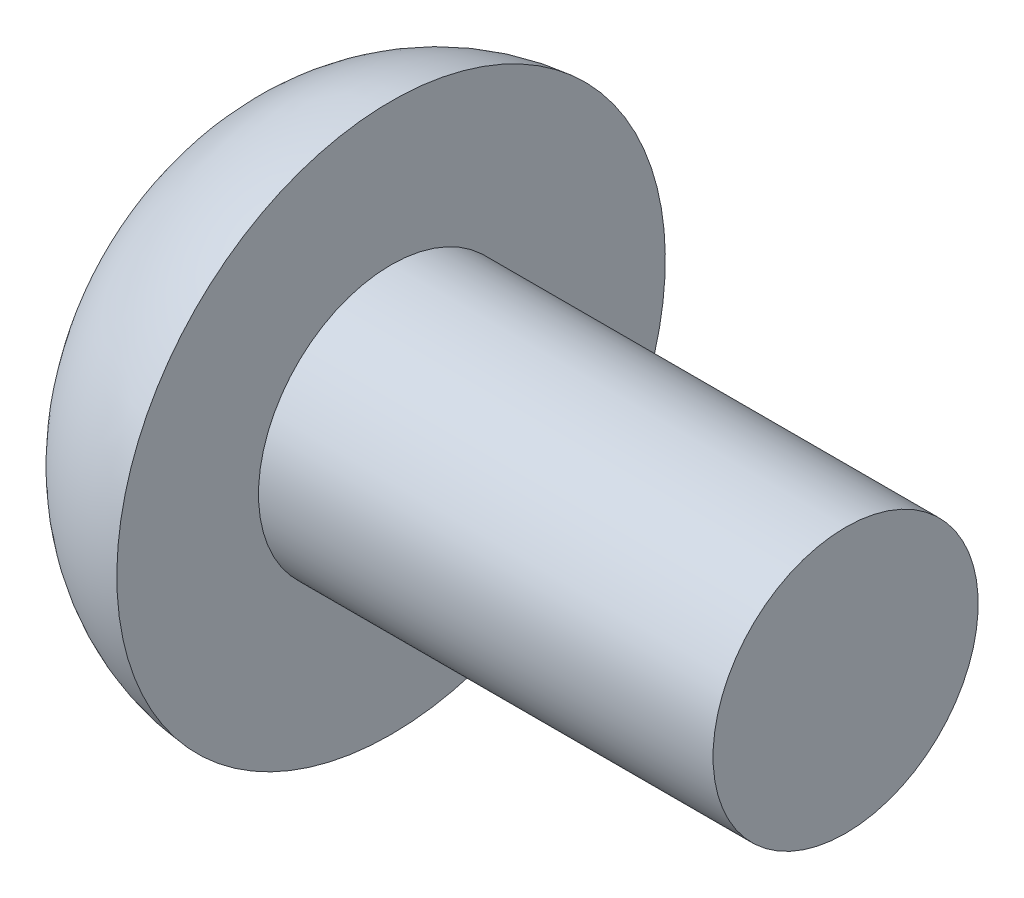
ISO-10303-21;
HEADER;
FILE_DESCRIPTION(('STEP AP214'),'2;1');
FILE_NAME('part.step','',(''),(''),'','','');
FILE_SCHEMA(('AUTOMOTIVE_DESIGN { 1 0 10303 214 1 1 1 1 }'));
ENDSEC;
DATA;
#1=APPLICATION_CONTEXT('core data for automotive mechanical design processes');
#2=APPLICATION_PROTOCOL_DEFINITION('international standard','automotive_design',2000,#1);
#3=PRODUCT_CONTEXT('',#1,'mechanical');
#4=PRODUCT('Part','Part','',(#3));
#5=PRODUCT_RELATED_PRODUCT_CATEGORY('part','',(#4));
#6=PRODUCT_DEFINITION_FORMATION('','',#4);
#7=PRODUCT_DEFINITION_CONTEXT('part definition',#1,'design');
#8=PRODUCT_DEFINITION('design','',#6,#7);
#9=PRODUCT_DEFINITION_SHAPE('','',#8);
#10=(LENGTH_UNIT() NAMED_UNIT(*) SI_UNIT(.MILLI.,.METRE.));
#11=(NAMED_UNIT(*) PLANE_ANGLE_UNIT() SI_UNIT($,.RADIAN.));
#12=(NAMED_UNIT(*) SI_UNIT($,.STERADIAN.) SOLID_ANGLE_UNIT());
#13=UNCERTAINTY_MEASURE_WITH_UNIT(LENGTH_MEASURE(1.E-05),#10,'distance_accuracy_value','');
#14=(GEOMETRIC_REPRESENTATION_CONTEXT(3) GLOBAL_UNCERTAINTY_ASSIGNED_CONTEXT((#13)) GLOBAL_UNIT_ASSIGNED_CONTEXT((#10,
#11,#12)) REPRESENTATION_CONTEXT('',''));
#15=CARTESIAN_POINT('',(0.,0.,0.));
#16=DIRECTION('',(0.,0.,1.));
#17=DIRECTION('',(1.,0.,0.));
#18=AXIS2_PLACEMENT_3D('',#15,#16,#17);
#19=CARTESIAN_POINT('',(8.2,1.75,0.));
#20=DIRECTION('',(-1.,0.,0.));
#21=DIRECTION('',(0.,-1.,0.));
#22=AXIS2_PLACEMENT_3D('',#19,#20,#21);
#23=PLANE('',#22);
#24=CARTESIAN_POINT('',(8.2,0.,0.));
#25=DIRECTION('',(-1.,0.,0.));
#26=DIRECTION('',(0.,-1.,0.));
#27=AXIS2_PLACEMENT_3D('',#24,#25,#26);
#28=CIRCLE('',#27,1.75);
#29=CARTESIAN_POINT('',(8.2,-1.75,0.));
#30=VERTEX_POINT('',#29);
#31=EDGE_CURVE('E11',#30,#30,#28,.T.);
#32=ORIENTED_EDGE('',*,*,#31,.F.);
#33=EDGE_LOOP('',(#32));
#34=FACE_BOUND('',#33,.T.);
#35=ADVANCED_FACE('F39',(#34),#23,.F.);
#36=CARTESIAN_POINT('',(0.,0.,0.));
#37=DIRECTION('',(-1.,0.,0.));
#38=DIRECTION('',(0.,-1.,0.));
#39=AXIS2_PLACEMENT_3D('',#36,#37,#38);
#40=CYLINDRICAL_SURFACE('',#39,1.75);
#41=CARTESIAN_POINT('',(2.2,0.,0.));
#42=DIRECTION('',(-1.,0.,0.));
#43=DIRECTION('',(0.,-1.,0.));
#44=AXIS2_PLACEMENT_3D('',#41,#42,#43);
#45=CIRCLE('',#44,1.75);
#46=CARTESIAN_POINT('',(2.2,-1.75,0.));
#47=VERTEX_POINT('',#46);
#48=EDGE_CURVE('E46',#47,#47,#45,.T.);
#49=ORIENTED_EDGE('',*,*,#48,.F.);
#50=EDGE_LOOP('',(#49));
#51=FACE_BOUND('',#50,.T.);
#52=ORIENTED_EDGE('',*,*,#31,.T.);
#53=EDGE_LOOP('',(#52));
#54=FACE_BOUND('',#53,.T.);
#55=ADVANCED_FACE('F155',(#51,#54),#40,.T.);
#56=CARTESIAN_POINT('',(2.2,3.62,0.));
#57=DIRECTION('',(-1.,0.,0.));
#58=DIRECTION('',(0.,-1.,0.));
#59=AXIS2_PLACEMENT_3D('',#56,#57,#58);
#60=PLANE('',#59);
#61=CARTESIAN_POINT('',(2.2,0.,0.));
#62=DIRECTION('',(-1.,0.,0.));
#63=DIRECTION('',(0.,-1.,0.));
#64=AXIS2_PLACEMENT_3D('',#61,#62,#63);
#65=CIRCLE('',#64,3.62);
#66=CARTESIAN_POINT('',(2.2,-3.62,0.));
#67=VERTEX_POINT('',#66);
#68=EDGE_CURVE('E148',#67,#67,#65,.T.);
#69=ORIENTED_EDGE('',*,*,#68,.F.);
#70=EDGE_LOOP('',(#69));
#71=FACE_BOUND('',#70,.T.);
#72=ORIENTED_EDGE('',*,*,#48,.T.);
#73=EDGE_LOOP('',(#72));
#74=FACE_BOUND('',#73,.T.);
#75=ADVANCED_FACE('F153',(#71,#74),#60,.F.);
#76=CARTESIAN_POINT('',(2.41252460432891,0.,0.));
#77=DIRECTION('',(-1.,0.,0.));
#78=DIRECTION('',(0.,-1.,0.));
#79=AXIS2_PLACEMENT_3D('',#76,#77,#78);
#80=DEGENERATE_TOROIDAL_SURFACE('',#79,0.87651117639183,2.75170813,.T.);
#81=CARTESIAN_POINT('',(0.,0.,0.));
#82=DIRECTION('',(-1.,0.,0.));
#83=DIRECTION('',(0.,-1.,0.));
#84=AXIS2_PLACEMENT_3D('',#81,#82,#83);
#85=CIRCLE('',#84,2.2);
#86=CARTESIAN_POINT('',(0.,-2.2,0.));
#87=VERTEX_POINT('',#86);
#88=EDGE_CURVE('E140',#87,#87,#85,.T.);
#89=ORIENTED_EDGE('',*,*,#88,.F.);
#90=EDGE_LOOP('',(#89));
#91=FACE_BOUND('',#90,.T.);
#92=ORIENTED_EDGE('',*,*,#68,.T.);
#93=EDGE_LOOP('',(#92));
#94=FACE_BOUND('',#93,.T.);
#95=ADVANCED_FACE('F174',(#91,#94),#80,.T.);
#96=CARTESIAN_POINT('',(0.,0.,0.));
#97=DIRECTION('',(1.,0.,0.));
#98=DIRECTION('',(0.,1.,0.));
#99=AXIS2_PLACEMENT_3D('',#96,#97,#98);
#100=PLANE('',#99);
#101=DIRECTION('',(0.,-0.5,-0.866025403784439));
#102=VECTOR('',#101,1.);
#103=CARTESIAN_POINT('',(0.,1.15470053837925,0.));
#104=LINE('',#103,#102);
#105=CARTESIAN_POINT('',(0.,1.15470053837925,0.));
#106=VERTEX_POINT('',#105);
#107=CARTESIAN_POINT('',(0.,0.577350269189626,-1.));
#108=VERTEX_POINT('',#107);
#109=EDGE_CURVE('E127',#106,#108,#104,.T.);
#110=ORIENTED_EDGE('',*,*,#109,.F.);
#111=DIRECTION('',(0.,0.5,-0.866025403784439));
#112=VECTOR('',#111,1.);
#113=CARTESIAN_POINT('',(0.,0.577350269189627,1.));
#114=LINE('',#113,#112);
#115=CARTESIAN_POINT('',(0.,0.577350269189627,1.));
#116=VERTEX_POINT('',#115);
#117=EDGE_CURVE('E53',#116,#106,#114,.T.);
#118=ORIENTED_EDGE('',*,*,#117,.F.);
#119=DIRECTION('',(0.,1.,0.));
#120=VECTOR('',#119,1.);
#121=CARTESIAN_POINT('',(0.,-0.577350269189626,1.));
#122=LINE('',#121,#120);
#123=CARTESIAN_POINT('',(0.,-0.577350269189626,1.));
#124=VERTEX_POINT('',#123);
#125=EDGE_CURVE('E136',#124,#116,#122,.T.);
#126=ORIENTED_EDGE('',*,*,#125,.F.);
#127=DIRECTION('',(0.,0.5,0.866025403784439));
#128=VECTOR('',#127,1.);
#129=CARTESIAN_POINT('',(0.,-1.15470053837925,0.));
#130=LINE('',#129,#128);
#131=CARTESIAN_POINT('',(0.,-1.15470053837925,0.));
#132=VERTEX_POINT('',#131);
#133=EDGE_CURVE('E134',#132,#124,#130,.T.);
#134=ORIENTED_EDGE('',*,*,#133,.F.);
#135=DIRECTION('',(0.,-0.5,0.866025403784439));
#136=VECTOR('',#135,1.);
#137=CARTESIAN_POINT('',(0.,-0.577350269189626,-1.));
#138=LINE('',#137,#136);
#139=CARTESIAN_POINT('',(0.,-0.577350269189626,-1.));
#140=VERTEX_POINT('',#139);
#141=EDGE_CURVE('E101',#140,#132,#138,.T.);
#142=ORIENTED_EDGE('',*,*,#141,.F.);
#143=DIRECTION('',(0.,-1.,0.));
#144=VECTOR('',#143,1.);
#145=CARTESIAN_POINT('',(0.,0.577350269189626,-1.));
#146=LINE('',#145,#144);
#147=EDGE_CURVE('E130',#108,#140,#146,.T.);
#148=ORIENTED_EDGE('',*,*,#147,.F.);
#149=EDGE_LOOP('',(#110,#118,#126,#134,#142,#148));
#150=FACE_BOUND('',#149,.T.);
#151=ORIENTED_EDGE('',*,*,#88,.T.);
#152=EDGE_LOOP('',(#151));
#153=FACE_BOUND('',#152,.T.);
#154=ADVANCED_FACE('F183',(#150,#153),#100,.F.);
#155=CARTESIAN_POINT('',(1.,0.577350269189627,1.));
#156=DIRECTION('',(0.,0.866025403784439,0.5));
#157=DIRECTION('',(0.,-0.5,0.866025403784439));
#158=AXIS2_PLACEMENT_3D('',#155,#156,#157);
#159=PLANE('',#158);
#160=ORIENTED_EDGE('',*,*,#117,.T.);
#161=DIRECTION('',(-1.,0.,0.));
#162=VECTOR('',#161,1.);
#163=CARTESIAN_POINT('',(1.,1.15470053837925,0.));
#164=LINE('',#163,#162);
#165=CARTESIAN_POINT('',(1.,1.15470053837925,0.));
#166=VERTEX_POINT('',#165);
#167=EDGE_CURVE('E83',#166,#106,#164,.T.);
#168=ORIENTED_EDGE('',*,*,#167,.F.);
#169=DIRECTION('',(0.,0.5,-0.866025403784439));
#170=VECTOR('',#169,1.);
#171=CARTESIAN_POINT('',(1.,0.577350269189627,1.));
#172=LINE('',#171,#170);
#173=CARTESIAN_POINT('',(1.,0.577350269189627,1.));
#174=VERTEX_POINT('',#173);
#175=EDGE_CURVE('E138',#174,#166,#172,.T.);
#176=ORIENTED_EDGE('',*,*,#175,.F.);
#177=DIRECTION('',(-1.,0.,0.));
#178=VECTOR('',#177,1.);
#179=CARTESIAN_POINT('',(1.,0.577350269189627,1.));
#180=LINE('',#179,#178);
#181=EDGE_CURVE('E61',#174,#116,#180,.T.);
#182=ORIENTED_EDGE('',*,*,#181,.T.);
#183=EDGE_LOOP('',(#160,#168,#176,#182));
#184=FACE_BOUND('',#183,.T.);
#185=ADVANCED_FACE('F191',(#184),#159,.F.);
#186=CARTESIAN_POINT('',(1.,-0.577350269189626,1.));
#187=DIRECTION('',(0.,0.,1.));
#188=DIRECTION('',(0.,-1.,0.));
#189=AXIS2_PLACEMENT_3D('',#186,#187,#188);
#190=PLANE('',#189);
#191=ORIENTED_EDGE('',*,*,#125,.T.);
#192=ORIENTED_EDGE('',*,*,#181,.F.);
#193=DIRECTION('',(0.,1.,0.));
#194=VECTOR('',#193,1.);
#195=CARTESIAN_POINT('',(1.,-0.577350269189626,1.));
#196=LINE('',#195,#194);
#197=CARTESIAN_POINT('',(1.,-0.577350269189626,1.));
#198=VERTEX_POINT('',#197);
#199=EDGE_CURVE('E113',#198,#174,#196,.T.);
#200=ORIENTED_EDGE('',*,*,#199,.F.);
#201=DIRECTION('',(-1.,0.,0.));
#202=VECTOR('',#201,1.);
#203=CARTESIAN_POINT('',(1.,-0.577350269189626,1.));
#204=LINE('',#203,#202);
#205=EDGE_CURVE('E105',#198,#124,#204,.T.);
#206=ORIENTED_EDGE('',*,*,#205,.T.);
#207=EDGE_LOOP('',(#191,#192,#200,#206));
#208=FACE_BOUND('',#207,.T.);
#209=ADVANCED_FACE('F199',(#208),#190,.F.);
#210=CARTESIAN_POINT('',(1.,-1.15470053837925,0.));
#211=DIRECTION('',(0.,-0.866025403784439,0.5));
#212=DIRECTION('',(0.,-0.5,-0.866025403784439));
#213=AXIS2_PLACEMENT_3D('',#210,#211,#212);
#214=PLANE('',#213);
#215=ORIENTED_EDGE('',*,*,#133,.T.);
#216=ORIENTED_EDGE('',*,*,#205,.F.);
#217=DIRECTION('',(0.,0.5,0.866025403784439));
#218=VECTOR('',#217,1.);
#219=CARTESIAN_POINT('',(1.,-1.15470053837925,0.));
#220=LINE('',#219,#218);
#221=CARTESIAN_POINT('',(1.,-1.15470053837925,0.));
#222=VERTEX_POINT('',#221);
#223=EDGE_CURVE('E109',#222,#198,#220,.T.);
#224=ORIENTED_EDGE('',*,*,#223,.F.);
#225=DIRECTION('',(-1.,0.,0.));
#226=VECTOR('',#225,1.);
#227=CARTESIAN_POINT('',(1.,-1.15470053837925,0.));
#228=LINE('',#227,#226);
#229=EDGE_CURVE('E94',#222,#132,#228,.T.);
#230=ORIENTED_EDGE('',*,*,#229,.T.);
#231=EDGE_LOOP('',(#215,#216,#224,#230));
#232=FACE_BOUND('',#231,.T.);
#233=ADVANCED_FACE('F110',(#232),#214,.F.);
#234=CARTESIAN_POINT('',(1.,-0.577350269189626,-1.));
#235=DIRECTION('',(0.,-0.866025403784439,-0.5));
#236=DIRECTION('',(0.,0.5,-0.866025403784439));
#237=AXIS2_PLACEMENT_3D('',#234,#235,#236);
#238=PLANE('',#237);
#239=ORIENTED_EDGE('',*,*,#141,.T.);
#240=ORIENTED_EDGE('',*,*,#229,.F.);
#241=DIRECTION('',(0.,-0.5,0.866025403784439));
#242=VECTOR('',#241,1.);
#243=CARTESIAN_POINT('',(1.,-0.577350269189626,-1.));
#244=LINE('',#243,#242);
#245=CARTESIAN_POINT('',(1.,-0.577350269189626,-1.));
#246=VERTEX_POINT('',#245);
#247=EDGE_CURVE('E98',#246,#222,#244,.T.);
#248=ORIENTED_EDGE('',*,*,#247,.F.);
#249=DIRECTION('',(-1.,0.,0.));
#250=VECTOR('',#249,1.);
#251=CARTESIAN_POINT('',(1.,-0.577350269189626,-1.));
#252=LINE('',#251,#250);
#253=EDGE_CURVE('E106',#246,#140,#252,.T.);
#254=ORIENTED_EDGE('',*,*,#253,.T.);
#255=EDGE_LOOP('',(#239,#240,#248,#254));
#256=FACE_BOUND('',#255,.T.);
#257=ADVANCED_FACE('F96',(#256),#238,.F.);
#258=CARTESIAN_POINT('',(1.,0.577350269189626,-1.));
#259=DIRECTION('',(0.,0.,-1.));
#260=DIRECTION('',(0.,1.,0.));
#261=AXIS2_PLACEMENT_3D('',#258,#259,#260);
#262=PLANE('',#261);
#263=ORIENTED_EDGE('',*,*,#147,.T.);
#264=ORIENTED_EDGE('',*,*,#253,.F.);
#265=DIRECTION('',(0.,-1.,0.));
#266=VECTOR('',#265,1.);
#267=CARTESIAN_POINT('',(1.,0.577350269189626,-1.));
#268=LINE('',#267,#266);
#269=CARTESIAN_POINT('',(1.,0.577350269189626,-1.));
#270=VERTEX_POINT('',#269);
#271=EDGE_CURVE('E119',#270,#246,#268,.T.);
#272=ORIENTED_EDGE('',*,*,#271,.F.);
#273=DIRECTION('',(-1.,0.,0.));
#274=VECTOR('',#273,1.);
#275=CARTESIAN_POINT('',(1.,0.577350269189626,-1.));
#276=LINE('',#275,#274);
#277=EDGE_CURVE('E143',#270,#108,#276,.T.);
#278=ORIENTED_EDGE('',*,*,#277,.T.);
#279=EDGE_LOOP('',(#263,#264,#272,#278));
#280=FACE_BOUND('',#279,.T.);
#281=ADVANCED_FACE('F218',(#280),#262,.F.);
#282=CARTESIAN_POINT('',(1.,1.15470053837925,0.));
#283=DIRECTION('',(0.,0.866025403784439,-0.5));
#284=DIRECTION('',(0.,0.5,0.866025403784439));
#285=AXIS2_PLACEMENT_3D('',#282,#283,#284);
#286=PLANE('',#285);
#287=ORIENTED_EDGE('',*,*,#109,.T.);
#288=ORIENTED_EDGE('',*,*,#277,.F.);
#289=DIRECTION('',(0.,-0.5,-0.866025403784439));
#290=VECTOR('',#289,1.);
#291=CARTESIAN_POINT('',(1.,1.15470053837925,0.));
#292=LINE('',#291,#290);
#293=EDGE_CURVE('E121',#166,#270,#292,.T.);
#294=ORIENTED_EDGE('',*,*,#293,.F.);
#295=ORIENTED_EDGE('',*,*,#167,.T.);
#296=EDGE_LOOP('',(#287,#288,#294,#295));
#297=FACE_BOUND('',#296,.T.);
#298=ADVANCED_FACE('F225',(#297),#286,.F.);
#299=CARTESIAN_POINT('',(1.,0.,0.));
#300=DIRECTION('',(-1.,0.,0.));
#301=DIRECTION('',(0.,-1.,0.));
#302=AXIS2_PLACEMENT_3D('',#299,#300,#301);
#303=PLANE('',#302);
#304=ORIENTED_EDGE('',*,*,#175,.T.);
#305=ORIENTED_EDGE('',*,*,#293,.T.);
#306=ORIENTED_EDGE('',*,*,#271,.T.);
#307=ORIENTED_EDGE('',*,*,#247,.T.);
#308=ORIENTED_EDGE('',*,*,#223,.T.);
#309=ORIENTED_EDGE('',*,*,#199,.T.);
#310=EDGE_LOOP('',(#304,#305,#306,#307,#308,#309));
#311=FACE_BOUND('',#310,.T.);
#312=ADVANCED_FACE('F116',(#311),#303,.T.);
#313=CLOSED_SHELL('',(#35,#55,#75,#95,#154,#185,#209,#233,#257,#281,#298,#312));
#314=MANIFOLD_SOLID_BREP('B2',#313);
#315=ADVANCED_BREP_SHAPE_REPRESENTATION('',(#18,#314),#14);
#316=SHAPE_DEFINITION_REPRESENTATION(#9,#315);
ENDSEC;
END-ISO-10303-21;
